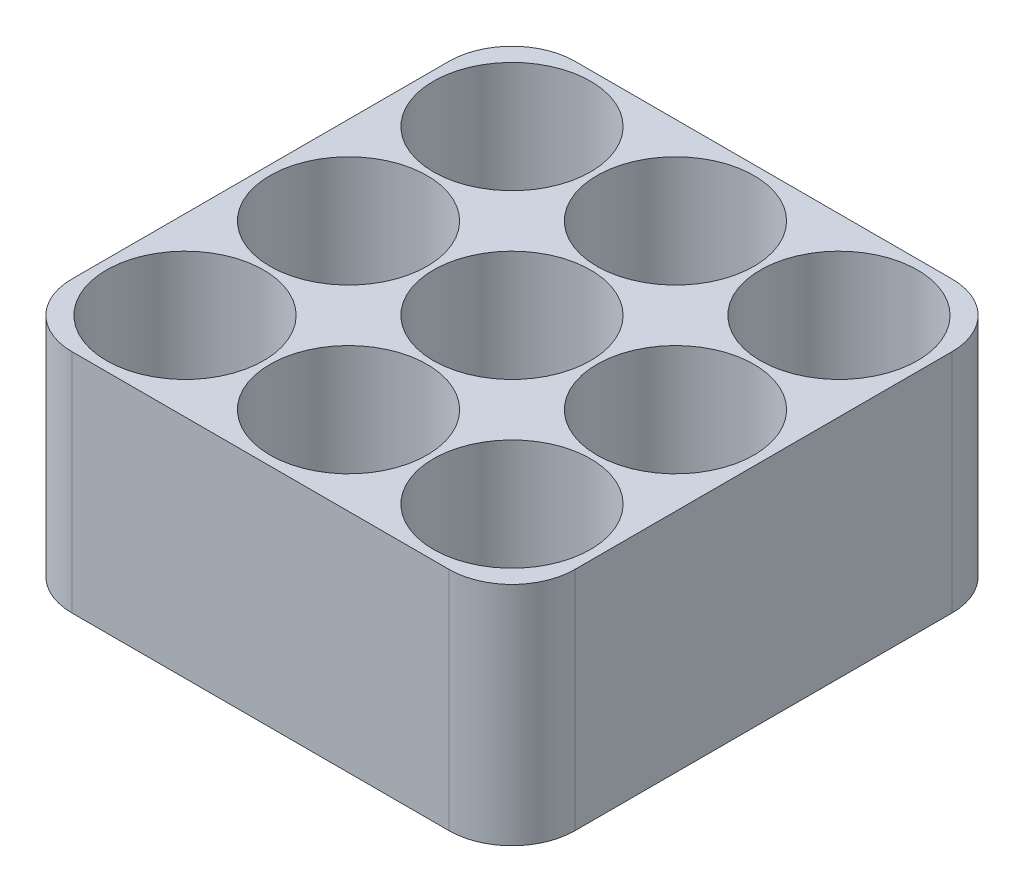
ISO-10303-21;
HEADER;
FILE_DESCRIPTION(('STEP AP214'),'2;1');
FILE_NAME('part.step','',(''),(''),'','','');
FILE_SCHEMA(('AUTOMOTIVE_DESIGN { 1 0 10303 214 1 1 1 1 }'));
ENDSEC;
DATA;
#1=APPLICATION_CONTEXT('core data for automotive mechanical design processes');
#2=APPLICATION_PROTOCOL_DEFINITION('international standard','automotive_design',2000,#1);
#3=PRODUCT_CONTEXT('',#1,'mechanical');
#4=PRODUCT('Part','Part','',(#3));
#5=PRODUCT_RELATED_PRODUCT_CATEGORY('part','',(#4));
#6=PRODUCT_DEFINITION_FORMATION('','',#4);
#7=PRODUCT_DEFINITION_CONTEXT('part definition',#1,'design');
#8=PRODUCT_DEFINITION('design','',#6,#7);
#9=PRODUCT_DEFINITION_SHAPE('','',#8);
#10=(LENGTH_UNIT() NAMED_UNIT(*) SI_UNIT(.MILLI.,.METRE.));
#11=(NAMED_UNIT(*) PLANE_ANGLE_UNIT() SI_UNIT($,.RADIAN.));
#12=(NAMED_UNIT(*) SI_UNIT($,.STERADIAN.) SOLID_ANGLE_UNIT());
#13=UNCERTAINTY_MEASURE_WITH_UNIT(LENGTH_MEASURE(1.E-05),#10,'distance_accuracy_value','');
#14=(GEOMETRIC_REPRESENTATION_CONTEXT(3) GLOBAL_UNCERTAINTY_ASSIGNED_CONTEXT((#13)) GLOBAL_UNIT_ASSIGNED_CONTEXT((#10,
#11,#12)) REPRESENTATION_CONTEXT('',''));
#15=CARTESIAN_POINT('',(0.,0.,0.));
#16=DIRECTION('',(0.,0.,1.));
#17=DIRECTION('',(1.,0.,0.));
#18=AXIS2_PLACEMENT_3D('',#15,#16,#17);
#19=CARTESIAN_POINT('',(0.,35.,0.));
#20=DIRECTION('',(0.,-1.,0.));
#21=DIRECTION('',(0.,0.,-1.));
#22=AXIS2_PLACEMENT_3D('',#19,#20,#21);
#23=PLANE('',#22);
#24=DIRECTION('',(1.,0.,0.));
#25=VECTOR('',#24,1.);
#26=CARTESIAN_POINT('',(-14.0000000000001,35.,14.));
#27=LINE('',#26,#25);
#28=CARTESIAN_POINT('',(-4.00000000000009,35.,14.));
#29=VERTEX_POINT('',#28);
#30=CARTESIAN_POINT('',(55.9999999999999,35.,14.));
#31=VERTEX_POINT('',#30);
#32=EDGE_CURVE('E123',#29,#31,#27,.T.);
#33=ORIENTED_EDGE('',*,*,#32,.T.);
#34=CARTESIAN_POINT('',(55.9999999999999,35.,4.));
#35=DIRECTION('',(0.,-1.,0.));
#36=DIRECTION('',(0.,0.,-1.));
#37=AXIS2_PLACEMENT_3D('',#34,#35,#36);
#38=CIRCLE('',#37,10.);
#39=CARTESIAN_POINT('',(65.9999999999999,35.,4.));
#40=VERTEX_POINT('',#39);
#41=EDGE_CURVE('E145',#31,#40,#38,.F.);
#42=ORIENTED_EDGE('',*,*,#41,.T.);
#43=DIRECTION('',(0.,0.,-1.));
#44=VECTOR('',#43,1.);
#45=CARTESIAN_POINT('',(65.9999999999999,35.,14.));
#46=LINE('',#45,#44);
#47=CARTESIAN_POINT('',(65.9999999999999,35.,-56.));
#48=VERTEX_POINT('',#47);
#49=EDGE_CURVE('E155',#40,#48,#46,.T.);
#50=ORIENTED_EDGE('',*,*,#49,.T.);
#51=CARTESIAN_POINT('',(55.9999999999999,35.,-56.));
#52=DIRECTION('',(0.,-1.,0.));
#53=DIRECTION('',(0.,0.,-1.));
#54=AXIS2_PLACEMENT_3D('',#51,#52,#53);
#55=CIRCLE('',#54,10.);
#56=CARTESIAN_POINT('',(55.9999999999999,35.,-66.));
#57=VERTEX_POINT('',#56);
#58=EDGE_CURVE('E122',#48,#57,#55,.F.);
#59=ORIENTED_EDGE('',*,*,#58,.T.);
#60=DIRECTION('',(-1.,0.,0.));
#61=VECTOR('',#60,1.);
#62=CARTESIAN_POINT('',(-14.0000000000001,35.,-66.));
#63=LINE('',#62,#61);
#64=CARTESIAN_POINT('',(-4.00000000000009,35.,-66.));
#65=VERTEX_POINT('',#64);
#66=EDGE_CURVE('E154',#57,#65,#63,.T.);
#67=ORIENTED_EDGE('',*,*,#66,.T.);
#68=CARTESIAN_POINT('',(-4.00000000000009,35.,-56.));
#69=DIRECTION('',(0.,-1.,0.));
#70=DIRECTION('',(0.,0.,-1.));
#71=AXIS2_PLACEMENT_3D('',#68,#69,#70);
#72=CIRCLE('',#71,10.);
#73=CARTESIAN_POINT('',(-14.0000000000001,35.,-56.));
#74=VERTEX_POINT('',#73);
#75=EDGE_CURVE('E55',#65,#74,#72,.F.);
#76=ORIENTED_EDGE('',*,*,#75,.T.);
#77=DIRECTION('',(0.,0.,1.));
#78=VECTOR('',#77,1.);
#79=CARTESIAN_POINT('',(-14.0000000000001,35.,14.));
#80=LINE('',#79,#78);
#81=CARTESIAN_POINT('',(-14.0000000000001,35.,4.));
#82=VERTEX_POINT('',#81);
#83=EDGE_CURVE('E127',#74,#82,#80,.T.);
#84=ORIENTED_EDGE('',*,*,#83,.T.);
#85=CARTESIAN_POINT('',(-4.00000000000009,35.,4.));
#86=DIRECTION('',(0.,-1.,0.));
#87=DIRECTION('',(0.,0.,-1.));
#88=AXIS2_PLACEMENT_3D('',#85,#86,#87);
#89=CIRCLE('',#88,10.);
#90=EDGE_CURVE('E143',#82,#29,#89,.F.);
#91=ORIENTED_EDGE('',*,*,#90,.T.);
#92=EDGE_LOOP('',(#33,#42,#50,#59,#67,#76,#84,#91));
#93=FACE_BOUND('',#92,.T.);
#94=CARTESIAN_POINT('',(0.,35.,0.));
#95=DIRECTION('',(0.,1.,0.));
#96=DIRECTION('',(0.,0.,1.));
#97=AXIS2_PLACEMENT_3D('',#94,#95,#96);
#98=CIRCLE('',#97,12.5);
#99=CARTESIAN_POINT('',(0.,35.,12.5));
#100=VERTEX_POINT('',#99);
#101=EDGE_CURVE('E157',#100,#100,#98,.T.);
#102=ORIENTED_EDGE('',*,*,#101,.F.);
#103=EDGE_LOOP('',(#102));
#104=FACE_BOUND('',#103,.T.);
#105=CARTESIAN_POINT('',(26.,35.,0.));
#106=DIRECTION('',(0.,1.,0.));
#107=DIRECTION('',(0.,0.,1.));
#108=AXIS2_PLACEMENT_3D('',#105,#106,#107);
#109=CIRCLE('',#108,12.5);
#110=CARTESIAN_POINT('',(26.,35.,12.5));
#111=VERTEX_POINT('',#110);
#112=EDGE_CURVE('E163',#111,#111,#109,.T.);
#113=ORIENTED_EDGE('',*,*,#112,.F.);
#114=EDGE_LOOP('',(#113));
#115=FACE_BOUND('',#114,.T.);
#116=CARTESIAN_POINT('',(52.,35.,0.));
#117=DIRECTION('',(0.,1.,0.));
#118=DIRECTION('',(0.,0.,1.));
#119=AXIS2_PLACEMENT_3D('',#116,#117,#118);
#120=CIRCLE('',#119,12.5);
#121=CARTESIAN_POINT('',(52.,35.,12.5));
#122=VERTEX_POINT('',#121);
#123=EDGE_CURVE('E169',#122,#122,#120,.T.);
#124=ORIENTED_EDGE('',*,*,#123,.F.);
#125=EDGE_LOOP('',(#124));
#126=FACE_BOUND('',#125,.T.);
#127=CARTESIAN_POINT('',(25.9999999999999,35.,-26.));
#128=DIRECTION('',(0.,1.,0.));
#129=DIRECTION('',(0.,0.,1.));
#130=AXIS2_PLACEMENT_3D('',#127,#128,#129);
#131=CIRCLE('',#130,12.5);
#132=CARTESIAN_POINT('',(25.9999999999999,35.,-13.5));
#133=VERTEX_POINT('',#132);
#134=EDGE_CURVE('E175',#133,#133,#131,.T.);
#135=ORIENTED_EDGE('',*,*,#134,.F.);
#136=EDGE_LOOP('',(#135));
#137=FACE_BOUND('',#136,.T.);
#138=CARTESIAN_POINT('',(51.9999999999999,35.,-26.));
#139=DIRECTION('',(0.,1.,0.));
#140=DIRECTION('',(0.,0.,1.));
#141=AXIS2_PLACEMENT_3D('',#138,#139,#140);
#142=CIRCLE('',#141,12.5);
#143=CARTESIAN_POINT('',(51.9999999999999,35.,-13.5));
#144=VERTEX_POINT('',#143);
#145=EDGE_CURVE('E181',#144,#144,#142,.T.);
#146=ORIENTED_EDGE('',*,*,#145,.F.);
#147=EDGE_LOOP('',(#146));
#148=FACE_BOUND('',#147,.T.);
#149=CARTESIAN_POINT('',(25.9999999999998,35.,-52.));
#150=DIRECTION('',(0.,1.,0.));
#151=DIRECTION('',(0.,0.,1.));
#152=AXIS2_PLACEMENT_3D('',#149,#150,#151);
#153=CIRCLE('',#152,12.5);
#154=CARTESIAN_POINT('',(25.9999999999998,35.,-39.5));
#155=VERTEX_POINT('',#154);
#156=EDGE_CURVE('E187',#155,#155,#153,.T.);
#157=ORIENTED_EDGE('',*,*,#156,.F.);
#158=EDGE_LOOP('',(#157));
#159=FACE_BOUND('',#158,.T.);
#160=CARTESIAN_POINT('',(51.9999999999998,35.,-52.));
#161=DIRECTION('',(0.,1.,0.));
#162=DIRECTION('',(0.,0.,1.));
#163=AXIS2_PLACEMENT_3D('',#160,#161,#162);
#164=CIRCLE('',#163,12.5);
#165=CARTESIAN_POINT('',(51.9999999999998,35.,-39.5));
#166=VERTEX_POINT('',#165);
#167=EDGE_CURVE('E193',#166,#166,#164,.T.);
#168=ORIENTED_EDGE('',*,*,#167,.F.);
#169=EDGE_LOOP('',(#168));
#170=FACE_BOUND('',#169,.T.);
#171=CARTESIAN_POINT('',(0.,35.,-26.));
#172=DIRECTION('',(0.,1.,0.));
#173=DIRECTION('',(0.,0.,1.));
#174=AXIS2_PLACEMENT_3D('',#171,#172,#173);
#175=CIRCLE('',#174,12.5);
#176=CARTESIAN_POINT('',(0.,35.,-13.5));
#177=VERTEX_POINT('',#176);
#178=EDGE_CURVE('E199',#177,#177,#175,.T.);
#179=ORIENTED_EDGE('',*,*,#178,.F.);
#180=EDGE_LOOP('',(#179));
#181=FACE_BOUND('',#180,.T.);
#182=CARTESIAN_POINT('',(-1.81557029619843E-13,35.,-52.));
#183=DIRECTION('',(0.,1.,0.));
#184=DIRECTION('',(0.,0.,1.));
#185=AXIS2_PLACEMENT_3D('',#182,#183,#184);
#186=CIRCLE('',#185,12.5);
#187=CARTESIAN_POINT('',(-1.81557029619843E-13,35.,-39.5));
#188=VERTEX_POINT('',#187);
#189=EDGE_CURVE('E205',#188,#188,#186,.T.);
#190=ORIENTED_EDGE('',*,*,#189,.F.);
#191=EDGE_LOOP('',(#190));
#192=FACE_BOUND('',#191,.T.);
#193=ADVANCED_FACE('F33',(#93,#104,#115,#126,#137,#148,#159,#170,#181,#192),#23,.F.);
#194=CARTESIAN_POINT('',(65.9999999999999,35.,14.));
#195=DIRECTION('',(-1.,0.,0.));
#196=DIRECTION('',(0.,0.,1.));
#197=AXIS2_PLACEMENT_3D('',#194,#195,#196);
#198=PLANE('',#197);
#199=ORIENTED_EDGE('',*,*,#49,.F.);
#200=DIRECTION('',(0.,-1.,0.));
#201=VECTOR('',#200,1.);
#202=CARTESIAN_POINT('',(65.9999999999999,35.,4.));
#203=LINE('',#202,#201);
#204=CARTESIAN_POINT('',(65.9999999999999,-1.,4.));
#205=VERTEX_POINT('',#204);
#206=EDGE_CURVE('E110',#40,#205,#203,.T.);
#207=ORIENTED_EDGE('',*,*,#206,.T.);
#208=DIRECTION('',(0.,0.,1.));
#209=VECTOR('',#208,1.);
#210=CARTESIAN_POINT('',(65.9999999999999,-1.,14.));
#211=LINE('',#210,#209);
#212=CARTESIAN_POINT('',(65.9999999999999,-1.,-56.));
#213=VERTEX_POINT('',#212);
#214=EDGE_CURVE('E102',#213,#205,#211,.T.);
#215=ORIENTED_EDGE('',*,*,#214,.F.);
#216=DIRECTION('',(0.,-1.,0.));
#217=VECTOR('',#216,1.);
#218=CARTESIAN_POINT('',(65.9999999999999,35.,-56.));
#219=LINE('',#218,#217);
#220=EDGE_CURVE('E116',#213,#48,#219,.F.);
#221=ORIENTED_EDGE('',*,*,#220,.T.);
#222=EDGE_LOOP('',(#199,#207,#215,#221));
#223=FACE_BOUND('',#222,.T.);
#224=ADVANCED_FACE('F115',(#223),#198,.F.);
#225=CARTESIAN_POINT('',(-14.0000000000001,35.,-66.));
#226=DIRECTION('',(0.,0.,1.));
#227=DIRECTION('',(1.,0.,0.));
#228=AXIS2_PLACEMENT_3D('',#225,#226,#227);
#229=PLANE('',#228);
#230=DIRECTION('',(1.,0.,0.));
#231=VECTOR('',#230,1.);
#232=CARTESIAN_POINT('',(65.9999999999999,-1.,-66.));
#233=LINE('',#232,#231);
#234=CARTESIAN_POINT('',(-4.00000000000009,-1.,-66.));
#235=VERTEX_POINT('',#234);
#236=CARTESIAN_POINT('',(55.9999999999999,-1.,-66.));
#237=VERTEX_POINT('',#236);
#238=EDGE_CURVE('E104',#235,#237,#233,.T.);
#239=ORIENTED_EDGE('',*,*,#238,.F.);
#240=DIRECTION('',(0.,-1.,0.));
#241=VECTOR('',#240,1.);
#242=CARTESIAN_POINT('',(-4.00000000000009,35.,-66.));
#243=LINE('',#242,#241);
#244=EDGE_CURVE('E11',#235,#65,#243,.F.);
#245=ORIENTED_EDGE('',*,*,#244,.T.);
#246=ORIENTED_EDGE('',*,*,#66,.F.);
#247=DIRECTION('',(0.,-1.,0.));
#248=VECTOR('',#247,1.);
#249=CARTESIAN_POINT('',(55.9999999999999,35.,-66.));
#250=LINE('',#249,#248);
#251=EDGE_CURVE('E41',#57,#237,#250,.T.);
#252=ORIENTED_EDGE('',*,*,#251,.T.);
#253=EDGE_LOOP('',(#239,#245,#246,#252));
#254=FACE_BOUND('',#253,.T.);
#255=ADVANCED_FACE('F152',(#254),#229,.F.);
#256=CARTESIAN_POINT('',(-14.0000000000001,35.,14.));
#257=DIRECTION('',(1.,0.,0.));
#258=DIRECTION('',(0.,0.,-1.));
#259=AXIS2_PLACEMENT_3D('',#256,#257,#258);
#260=PLANE('',#259);
#261=DIRECTION('',(0.,0.,-1.));
#262=VECTOR('',#261,1.);
#263=CARTESIAN_POINT('',(-14.0000000000001,-1.,14.));
#264=LINE('',#263,#262);
#265=CARTESIAN_POINT('',(-14.0000000000001,-1.,4.));
#266=VERTEX_POINT('',#265);
#267=CARTESIAN_POINT('',(-14.0000000000001,-1.,-56.));
#268=VERTEX_POINT('',#267);
#269=EDGE_CURVE('E214',#266,#268,#264,.T.);
#270=ORIENTED_EDGE('',*,*,#269,.F.);
#271=DIRECTION('',(0.,-1.,0.));
#272=VECTOR('',#271,1.);
#273=CARTESIAN_POINT('',(-14.0000000000001,35.,4.));
#274=LINE('',#273,#272);
#275=EDGE_CURVE('E48',#266,#82,#274,.F.);
#276=ORIENTED_EDGE('',*,*,#275,.T.);
#277=ORIENTED_EDGE('',*,*,#83,.F.);
#278=DIRECTION('',(0.,-1.,0.));
#279=VECTOR('',#278,1.);
#280=CARTESIAN_POINT('',(-14.0000000000001,35.,-56.));
#281=LINE('',#280,#279);
#282=EDGE_CURVE('E147',#74,#268,#281,.T.);
#283=ORIENTED_EDGE('',*,*,#282,.T.);
#284=EDGE_LOOP('',(#270,#276,#277,#283));
#285=FACE_BOUND('',#284,.T.);
#286=ADVANCED_FACE('F252',(#285),#260,.F.);
#287=CARTESIAN_POINT('',(-14.0000000000001,35.,14.));
#288=DIRECTION('',(0.,0.,-1.));
#289=DIRECTION('',(-1.,0.,0.));
#290=AXIS2_PLACEMENT_3D('',#287,#288,#289);
#291=PLANE('',#290);
#292=DIRECTION('',(-1.,0.,0.));
#293=VECTOR('',#292,1.);
#294=CARTESIAN_POINT('',(65.9999999999999,-1.,14.));
#295=LINE('',#294,#293);
#296=CARTESIAN_POINT('',(55.9999999999999,-1.,14.));
#297=VERTEX_POINT('',#296);
#298=CARTESIAN_POINT('',(-4.00000000000009,-1.,14.));
#299=VERTEX_POINT('',#298);
#300=EDGE_CURVE('E119',#297,#299,#295,.T.);
#301=ORIENTED_EDGE('',*,*,#300,.F.);
#302=DIRECTION('',(0.,-1.,0.));
#303=VECTOR('',#302,1.);
#304=CARTESIAN_POINT('',(55.9999999999999,35.,14.));
#305=LINE('',#304,#303);
#306=EDGE_CURVE('E139',#297,#31,#305,.F.);
#307=ORIENTED_EDGE('',*,*,#306,.T.);
#308=ORIENTED_EDGE('',*,*,#32,.F.);
#309=DIRECTION('',(0.,-1.,0.));
#310=VECTOR('',#309,1.);
#311=CARTESIAN_POINT('',(-4.00000000000009,35.,14.));
#312=LINE('',#311,#310);
#313=EDGE_CURVE('E136',#29,#299,#312,.T.);
#314=ORIENTED_EDGE('',*,*,#313,.T.);
#315=EDGE_LOOP('',(#301,#307,#308,#314));
#316=FACE_BOUND('',#315,.T.);
#317=ADVANCED_FACE('F221',(#316),#291,.F.);
#318=CARTESIAN_POINT('',(0.,35.,0.));
#319=DIRECTION('',(0.,-1.,0.));
#320=DIRECTION('',(0.,0.,-1.));
#321=AXIS2_PLACEMENT_3D('',#318,#319,#320);
#322=CYLINDRICAL_SURFACE('',#321,12.5);
#323=ORIENTED_EDGE('',*,*,#101,.T.);
#324=EDGE_LOOP('',(#323));
#325=FACE_BOUND('',#324,.T.);
#326=CARTESIAN_POINT('',(0.,0.,0.));
#327=DIRECTION('',(0.,1.,0.));
#328=DIRECTION('',(0.,0.,1.));
#329=AXIS2_PLACEMENT_3D('',#326,#327,#328);
#330=CIRCLE('',#329,12.5);
#331=CARTESIAN_POINT('',(0.,0.,12.5));
#332=VERTEX_POINT('',#331);
#333=EDGE_CURVE('E160',#332,#332,#330,.T.);
#334=ORIENTED_EDGE('',*,*,#333,.F.);
#335=EDGE_LOOP('',(#334));
#336=FACE_BOUND('',#335,.T.);
#337=ADVANCED_FACE('F248',(#325,#336),#322,.F.);
#338=CARTESIAN_POINT('',(26.,35.,0.));
#339=DIRECTION('',(0.,-1.,0.));
#340=DIRECTION('',(0.,0.,-1.));
#341=AXIS2_PLACEMENT_3D('',#338,#339,#340);
#342=CYLINDRICAL_SURFACE('',#341,12.5);
#343=ORIENTED_EDGE('',*,*,#112,.T.);
#344=EDGE_LOOP('',(#343));
#345=FACE_BOUND('',#344,.T.);
#346=CARTESIAN_POINT('',(26.,0.,0.));
#347=DIRECTION('',(0.,1.,0.));
#348=DIRECTION('',(0.,0.,1.));
#349=AXIS2_PLACEMENT_3D('',#346,#347,#348);
#350=CIRCLE('',#349,12.5);
#351=CARTESIAN_POINT('',(26.,0.,12.5));
#352=VERTEX_POINT('',#351);
#353=EDGE_CURVE('E166',#352,#352,#350,.T.);
#354=ORIENTED_EDGE('',*,*,#353,.F.);
#355=EDGE_LOOP('',(#354));
#356=FACE_BOUND('',#355,.T.);
#357=ADVANCED_FACE('F275',(#345,#356),#342,.F.);
#358=CARTESIAN_POINT('',(52.,35.,0.));
#359=DIRECTION('',(0.,-1.,0.));
#360=DIRECTION('',(0.,0.,-1.));
#361=AXIS2_PLACEMENT_3D('',#358,#359,#360);
#362=CYLINDRICAL_SURFACE('',#361,12.5);
#363=ORIENTED_EDGE('',*,*,#123,.T.);
#364=EDGE_LOOP('',(#363));
#365=FACE_BOUND('',#364,.T.);
#366=CARTESIAN_POINT('',(52.,0.,0.));
#367=DIRECTION('',(0.,1.,0.));
#368=DIRECTION('',(0.,0.,1.));
#369=AXIS2_PLACEMENT_3D('',#366,#367,#368);
#370=CIRCLE('',#369,12.5);
#371=CARTESIAN_POINT('',(52.,0.,12.5));
#372=VERTEX_POINT('',#371);
#373=EDGE_CURVE('E172',#372,#372,#370,.T.);
#374=ORIENTED_EDGE('',*,*,#373,.F.);
#375=EDGE_LOOP('',(#374));
#376=FACE_BOUND('',#375,.T.);
#377=ADVANCED_FACE('F282',(#365,#376),#362,.F.);
#378=CARTESIAN_POINT('',(25.9999999999999,35.,-26.));
#379=DIRECTION('',(0.,-1.,0.));
#380=DIRECTION('',(0.,0.,-1.));
#381=AXIS2_PLACEMENT_3D('',#378,#379,#380);
#382=CYLINDRICAL_SURFACE('',#381,12.5);
#383=ORIENTED_EDGE('',*,*,#134,.T.);
#384=EDGE_LOOP('',(#383));
#385=FACE_BOUND('',#384,.T.);
#386=CARTESIAN_POINT('',(25.9999999999999,0.,-26.));
#387=DIRECTION('',(0.,1.,0.));
#388=DIRECTION('',(0.,0.,1.));
#389=AXIS2_PLACEMENT_3D('',#386,#387,#388);
#390=CIRCLE('',#389,12.5);
#391=CARTESIAN_POINT('',(25.9999999999999,0.,-13.5));
#392=VERTEX_POINT('',#391);
#393=EDGE_CURVE('E178',#392,#392,#390,.T.);
#394=ORIENTED_EDGE('',*,*,#393,.F.);
#395=EDGE_LOOP('',(#394));
#396=FACE_BOUND('',#395,.T.);
#397=ADVANCED_FACE('F289',(#385,#396),#382,.F.);
#398=CARTESIAN_POINT('',(51.9999999999999,35.,-26.));
#399=DIRECTION('',(0.,-1.,0.));
#400=DIRECTION('',(0.,0.,-1.));
#401=AXIS2_PLACEMENT_3D('',#398,#399,#400);
#402=CYLINDRICAL_SURFACE('',#401,12.5);
#403=ORIENTED_EDGE('',*,*,#145,.T.);
#404=EDGE_LOOP('',(#403));
#405=FACE_BOUND('',#404,.T.);
#406=CARTESIAN_POINT('',(51.9999999999999,0.,-26.));
#407=DIRECTION('',(0.,1.,0.));
#408=DIRECTION('',(0.,0.,1.));
#409=AXIS2_PLACEMENT_3D('',#406,#407,#408);
#410=CIRCLE('',#409,12.5);
#411=CARTESIAN_POINT('',(51.9999999999999,0.,-13.5));
#412=VERTEX_POINT('',#411);
#413=EDGE_CURVE('E184',#412,#412,#410,.T.);
#414=ORIENTED_EDGE('',*,*,#413,.F.);
#415=EDGE_LOOP('',(#414));
#416=FACE_BOUND('',#415,.T.);
#417=ADVANCED_FACE('F297',(#405,#416),#402,.F.);
#418=CARTESIAN_POINT('',(25.9999999999998,35.,-52.));
#419=DIRECTION('',(0.,-1.,0.));
#420=DIRECTION('',(0.,0.,-1.));
#421=AXIS2_PLACEMENT_3D('',#418,#419,#420);
#422=CYLINDRICAL_SURFACE('',#421,12.5);
#423=ORIENTED_EDGE('',*,*,#156,.T.);
#424=EDGE_LOOP('',(#423));
#425=FACE_BOUND('',#424,.T.);
#426=CARTESIAN_POINT('',(25.9999999999998,0.,-52.));
#427=DIRECTION('',(0.,1.,0.));
#428=DIRECTION('',(0.,0.,1.));
#429=AXIS2_PLACEMENT_3D('',#426,#427,#428);
#430=CIRCLE('',#429,12.5);
#431=CARTESIAN_POINT('',(25.9999999999998,0.,-39.5));
#432=VERTEX_POINT('',#431);
#433=EDGE_CURVE('E190',#432,#432,#430,.T.);
#434=ORIENTED_EDGE('',*,*,#433,.F.);
#435=EDGE_LOOP('',(#434));
#436=FACE_BOUND('',#435,.T.);
#437=ADVANCED_FACE('F305',(#425,#436),#422,.F.);
#438=CARTESIAN_POINT('',(51.9999999999998,35.,-52.));
#439=DIRECTION('',(0.,-1.,0.));
#440=DIRECTION('',(0.,0.,-1.));
#441=AXIS2_PLACEMENT_3D('',#438,#439,#440);
#442=CYLINDRICAL_SURFACE('',#441,12.5);
#443=ORIENTED_EDGE('',*,*,#167,.T.);
#444=EDGE_LOOP('',(#443));
#445=FACE_BOUND('',#444,.T.);
#446=CARTESIAN_POINT('',(51.9999999999998,0.,-52.));
#447=DIRECTION('',(0.,1.,0.));
#448=DIRECTION('',(0.,0.,1.));
#449=AXIS2_PLACEMENT_3D('',#446,#447,#448);
#450=CIRCLE('',#449,12.5);
#451=CARTESIAN_POINT('',(51.9999999999998,0.,-39.5));
#452=VERTEX_POINT('',#451);
#453=EDGE_CURVE('E196',#452,#452,#450,.T.);
#454=ORIENTED_EDGE('',*,*,#453,.F.);
#455=EDGE_LOOP('',(#454));
#456=FACE_BOUND('',#455,.T.);
#457=ADVANCED_FACE('F313',(#445,#456),#442,.F.);
#458=CARTESIAN_POINT('',(0.,35.,-26.));
#459=DIRECTION('',(0.,-1.,0.));
#460=DIRECTION('',(0.,0.,-1.));
#461=AXIS2_PLACEMENT_3D('',#458,#459,#460);
#462=CYLINDRICAL_SURFACE('',#461,12.5);
#463=ORIENTED_EDGE('',*,*,#178,.T.);
#464=EDGE_LOOP('',(#463));
#465=FACE_BOUND('',#464,.T.);
#466=CARTESIAN_POINT('',(0.,0.,-26.));
#467=DIRECTION('',(0.,1.,0.));
#468=DIRECTION('',(0.,0.,1.));
#469=AXIS2_PLACEMENT_3D('',#466,#467,#468);
#470=CIRCLE('',#469,12.5);
#471=CARTESIAN_POINT('',(0.,0.,-13.5));
#472=VERTEX_POINT('',#471);
#473=EDGE_CURVE('E202',#472,#472,#470,.T.);
#474=ORIENTED_EDGE('',*,*,#473,.F.);
#475=EDGE_LOOP('',(#474));
#476=FACE_BOUND('',#475,.T.);
#477=ADVANCED_FACE('F321',(#465,#476),#462,.F.);
#478=CARTESIAN_POINT('',(-1.81557029619843E-13,35.,-52.));
#479=DIRECTION('',(0.,-1.,0.));
#480=DIRECTION('',(0.,0.,-1.));
#481=AXIS2_PLACEMENT_3D('',#478,#479,#480);
#482=CYLINDRICAL_SURFACE('',#481,12.5);
#483=ORIENTED_EDGE('',*,*,#189,.T.);
#484=EDGE_LOOP('',(#483));
#485=FACE_BOUND('',#484,.T.);
#486=CARTESIAN_POINT('',(-1.81557029619843E-13,0.,-52.));
#487=DIRECTION('',(0.,1.,0.));
#488=DIRECTION('',(0.,0.,1.));
#489=AXIS2_PLACEMENT_3D('',#486,#487,#488);
#490=CIRCLE('',#489,12.5);
#491=CARTESIAN_POINT('',(-1.81557029619843E-13,0.,-39.5));
#492=VERTEX_POINT('',#491);
#493=EDGE_CURVE('E208',#492,#492,#490,.T.);
#494=ORIENTED_EDGE('',*,*,#493,.F.);
#495=EDGE_LOOP('',(#494));
#496=FACE_BOUND('',#495,.T.);
#497=ADVANCED_FACE('F329',(#485,#496),#482,.F.);
#498=CARTESIAN_POINT('',(0.,0.,0.));
#499=DIRECTION('',(0.,1.,0.));
#500=DIRECTION('',(0.,0.,1.));
#501=AXIS2_PLACEMENT_3D('',#498,#499,#500);
#502=PLANE('',#501);
#503=ORIENTED_EDGE('',*,*,#493,.T.);
#504=EDGE_LOOP('',(#503));
#505=FACE_BOUND('',#504,.T.);
#506=ADVANCED_FACE('F337',(#505),#502,.T.);
#507=ORIENTED_EDGE('',*,*,#473,.T.);
#508=EDGE_LOOP('',(#507));
#509=FACE_BOUND('',#508,.T.);
#510=ADVANCED_FACE('F345',(#509),#502,.T.);
#511=ORIENTED_EDGE('',*,*,#453,.T.);
#512=EDGE_LOOP('',(#511));
#513=FACE_BOUND('',#512,.T.);
#514=ADVANCED_FACE('F354',(#513),#502,.T.);
#515=ORIENTED_EDGE('',*,*,#433,.T.);
#516=EDGE_LOOP('',(#515));
#517=FACE_BOUND('',#516,.T.);
#518=ADVANCED_FACE('F361',(#517),#502,.T.);
#519=ORIENTED_EDGE('',*,*,#413,.T.);
#520=EDGE_LOOP('',(#519));
#521=FACE_BOUND('',#520,.T.);
#522=ADVANCED_FACE('F368',(#521),#502,.T.);
#523=ORIENTED_EDGE('',*,*,#393,.T.);
#524=EDGE_LOOP('',(#523));
#525=FACE_BOUND('',#524,.T.);
#526=ADVANCED_FACE('F375',(#525),#502,.T.);
#527=ORIENTED_EDGE('',*,*,#373,.T.);
#528=EDGE_LOOP('',(#527));
#529=FACE_BOUND('',#528,.T.);
#530=ADVANCED_FACE('F382',(#529),#502,.T.);
#531=ORIENTED_EDGE('',*,*,#353,.T.);
#532=EDGE_LOOP('',(#531));
#533=FACE_BOUND('',#532,.T.);
#534=ADVANCED_FACE('F389',(#533),#502,.T.);
#535=ORIENTED_EDGE('',*,*,#333,.T.);
#536=EDGE_LOOP('',(#535));
#537=FACE_BOUND('',#536,.T.);
#538=ADVANCED_FACE('F348',(#537),#502,.T.);
#539=CARTESIAN_POINT('',(0.,-1.,0.));
#540=DIRECTION('',(0.,1.,0.));
#541=DIRECTION('',(0.,0.,1.));
#542=AXIS2_PLACEMENT_3D('',#539,#540,#541);
#543=PLANE('',#542);
#544=ORIENTED_EDGE('',*,*,#214,.T.);
#545=CARTESIAN_POINT('',(55.9999999999999,-1.,4.));
#546=DIRECTION('',(0.,1.,0.));
#547=DIRECTION('',(0.,0.,1.));
#548=AXIS2_PLACEMENT_3D('',#545,#546,#547);
#549=CIRCLE('',#548,10.);
#550=EDGE_CURVE('E134',#205,#297,#549,.F.);
#551=ORIENTED_EDGE('',*,*,#550,.T.);
#552=ORIENTED_EDGE('',*,*,#300,.T.);
#553=CARTESIAN_POINT('',(-4.00000000000009,-1.,4.));
#554=DIRECTION('',(0.,1.,0.));
#555=DIRECTION('',(0.,0.,1.));
#556=AXIS2_PLACEMENT_3D('',#553,#554,#555);
#557=CIRCLE('',#556,10.);
#558=EDGE_CURVE('E132',#299,#266,#557,.F.);
#559=ORIENTED_EDGE('',*,*,#558,.T.);
#560=ORIENTED_EDGE('',*,*,#269,.T.);
#561=CARTESIAN_POINT('',(-4.00000000000009,-1.,-56.));
#562=DIRECTION('',(0.,1.,0.));
#563=DIRECTION('',(0.,0.,1.));
#564=AXIS2_PLACEMENT_3D('',#561,#562,#563);
#565=CIRCLE('',#564,10.);
#566=EDGE_CURVE('E109',#268,#235,#565,.F.);
#567=ORIENTED_EDGE('',*,*,#566,.T.);
#568=ORIENTED_EDGE('',*,*,#238,.T.);
#569=CARTESIAN_POINT('',(55.9999999999999,-1.,-56.));
#570=DIRECTION('',(0.,1.,0.));
#571=DIRECTION('',(0.,0.,1.));
#572=AXIS2_PLACEMENT_3D('',#569,#570,#571);
#573=CIRCLE('',#572,10.);
#574=EDGE_CURVE('E99',#237,#213,#573,.F.);
#575=ORIENTED_EDGE('',*,*,#574,.T.);
#576=EDGE_LOOP('',(#544,#551,#552,#559,#560,#567,#568,#575));
#577=FACE_BOUND('',#576,.T.);
#578=ADVANCED_FACE('F101',(#577),#543,.F.);
#579=CARTESIAN_POINT('',(55.9999999999999,35.,4.));
#580=DIRECTION('',(0.,-1.,0.));
#581=DIRECTION('',(0.,0.,-1.));
#582=AXIS2_PLACEMENT_3D('',#579,#580,#581);
#583=CYLINDRICAL_SURFACE('',#582,10.);
#584=ORIENTED_EDGE('',*,*,#41,.F.);
#585=ORIENTED_EDGE('',*,*,#306,.F.);
#586=ORIENTED_EDGE('',*,*,#550,.F.);
#587=ORIENTED_EDGE('',*,*,#206,.F.);
#588=EDGE_LOOP('',(#584,#585,#586,#587));
#589=FACE_BOUND('',#588,.T.);
#590=ADVANCED_FACE('F226',(#589),#583,.T.);
#591=CARTESIAN_POINT('',(-4.00000000000009,35.,4.));
#592=DIRECTION('',(0.,-1.,0.));
#593=DIRECTION('',(0.,0.,-1.));
#594=AXIS2_PLACEMENT_3D('',#591,#592,#593);
#595=CYLINDRICAL_SURFACE('',#594,10.);
#596=ORIENTED_EDGE('',*,*,#90,.F.);
#597=ORIENTED_EDGE('',*,*,#275,.F.);
#598=ORIENTED_EDGE('',*,*,#558,.F.);
#599=ORIENTED_EDGE('',*,*,#313,.F.);
#600=EDGE_LOOP('',(#596,#597,#598,#599));
#601=FACE_BOUND('',#600,.T.);
#602=ADVANCED_FACE('F230',(#601),#595,.T.);
#603=CARTESIAN_POINT('',(-4.00000000000009,35.,-56.));
#604=DIRECTION('',(0.,-1.,0.));
#605=DIRECTION('',(0.,0.,-1.));
#606=AXIS2_PLACEMENT_3D('',#603,#604,#605);
#607=CYLINDRICAL_SURFACE('',#606,10.);
#608=ORIENTED_EDGE('',*,*,#75,.F.);
#609=ORIENTED_EDGE('',*,*,#244,.F.);
#610=ORIENTED_EDGE('',*,*,#566,.F.);
#611=ORIENTED_EDGE('',*,*,#282,.F.);
#612=EDGE_LOOP('',(#608,#609,#610,#611));
#613=FACE_BOUND('',#612,.T.);
#614=ADVANCED_FACE('F232',(#613),#607,.T.);
#615=CARTESIAN_POINT('',(55.9999999999999,35.,-56.));
#616=DIRECTION('',(0.,-1.,0.));
#617=DIRECTION('',(0.,0.,-1.));
#618=AXIS2_PLACEMENT_3D('',#615,#616,#617);
#619=CYLINDRICAL_SURFACE('',#618,10.);
#620=ORIENTED_EDGE('',*,*,#58,.F.);
#621=ORIENTED_EDGE('',*,*,#220,.F.);
#622=ORIENTED_EDGE('',*,*,#574,.F.);
#623=ORIENTED_EDGE('',*,*,#251,.F.);
#624=EDGE_LOOP('',(#620,#621,#622,#623));
#625=FACE_BOUND('',#624,.T.);
#626=ADVANCED_FACE('F35',(#625),#619,.T.);
#627=CLOSED_SHELL('',(#193,#224,#255,#286,#317,#337,#357,#377,#397,#417,#437,#457,#477,#497,
#506,#510,#514,#518,#522,#526,#530,#534,#538,#578,#590,#602,#614,#626));
#628=MANIFOLD_SOLID_BREP('B2',#627);
#629=ADVANCED_BREP_SHAPE_REPRESENTATION('',(#18,#628),#14);
#630=SHAPE_DEFINITION_REPRESENTATION(#9,#629);
ENDSEC;
END-ISO-10303-21;
